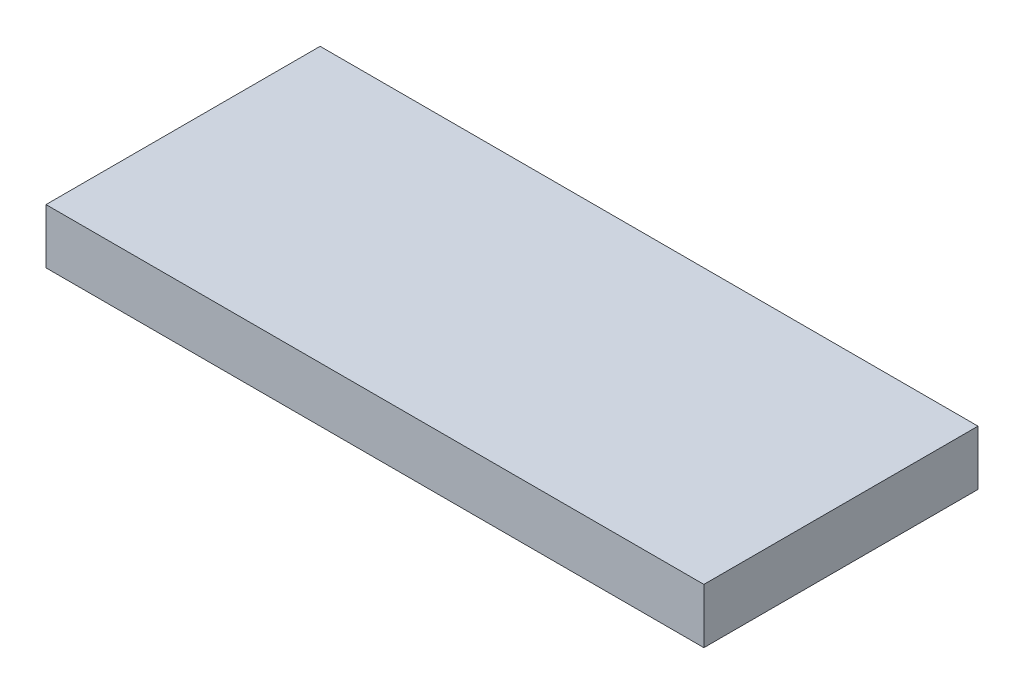
ISO-10303-21;
HEADER;
FILE_DESCRIPTION(('STEP AP214'),'2;1');
FILE_NAME('part.step','',(''),(''),'','','');
FILE_SCHEMA(('AUTOMOTIVE_DESIGN { 1 0 10303 214 1 1 1 1 }'));
ENDSEC;
DATA;
#1=APPLICATION_CONTEXT('core data for automotive mechanical design processes');
#2=APPLICATION_PROTOCOL_DEFINITION('international standard','automotive_design',2000,#1);
#3=PRODUCT_CONTEXT('',#1,'mechanical');
#4=PRODUCT('Part','Part','',(#3));
#5=PRODUCT_RELATED_PRODUCT_CATEGORY('part','',(#4));
#6=PRODUCT_DEFINITION_FORMATION('','',#4);
#7=PRODUCT_DEFINITION_CONTEXT('part definition',#1,'design');
#8=PRODUCT_DEFINITION('design','',#6,#7);
#9=PRODUCT_DEFINITION_SHAPE('','',#8);
#10=(LENGTH_UNIT() NAMED_UNIT(*) SI_UNIT(.MILLI.,.METRE.));
#11=(NAMED_UNIT(*) PLANE_ANGLE_UNIT() SI_UNIT($,.RADIAN.));
#12=(NAMED_UNIT(*) SI_UNIT($,.STERADIAN.) SOLID_ANGLE_UNIT());
#13=UNCERTAINTY_MEASURE_WITH_UNIT(LENGTH_MEASURE(1.E-05),#10,'distance_accuracy_value','');
#14=(GEOMETRIC_REPRESENTATION_CONTEXT(3) GLOBAL_UNCERTAINTY_ASSIGNED_CONTEXT((#13)) GLOBAL_UNIT_ASSIGNED_CONTEXT((#10,
#11,#12)) REPRESENTATION_CONTEXT('',''));
#15=CARTESIAN_POINT('',(0.,0.,0.));
#16=DIRECTION('',(0.,0.,1.));
#17=DIRECTION('',(1.,0.,0.));
#18=AXIS2_PLACEMENT_3D('',#15,#16,#17);
#19=CARTESIAN_POINT('',(60.,10.,-25.));
#20=DIRECTION('',(-1.,0.,0.));
#21=DIRECTION('',(0.,0.,1.));
#22=AXIS2_PLACEMENT_3D('',#19,#20,#21);
#23=PLANE('',#22);
#24=DIRECTION('',(0.,0.,-1.));
#25=VECTOR('',#24,1.);
#26=CARTESIAN_POINT('',(60.,0.,-25.));
#27=LINE('',#26,#25);
#28=CARTESIAN_POINT('',(60.,0.,25.));
#29=VERTEX_POINT('',#28);
#30=CARTESIAN_POINT('',(60.,0.,-25.));
#31=VERTEX_POINT('',#30);
#32=EDGE_CURVE('E102',#29,#31,#27,.T.);
#33=ORIENTED_EDGE('',*,*,#32,.T.);
#34=DIRECTION('',(0.,-1.,0.));
#35=VECTOR('',#34,1.);
#36=CARTESIAN_POINT('',(60.,10.,-25.));
#37=LINE('',#36,#35);
#38=CARTESIAN_POINT('',(60.,10.,-25.));
#39=VERTEX_POINT('',#38);
#40=EDGE_CURVE('E11',#39,#31,#37,.T.);
#41=ORIENTED_EDGE('',*,*,#40,.F.);
#42=DIRECTION('',(0.,0.,-1.));
#43=VECTOR('',#42,1.);
#44=CARTESIAN_POINT('',(60.,10.,-25.));
#45=LINE('',#44,#43);
#46=CARTESIAN_POINT('',(60.,10.,25.));
#47=VERTEX_POINT('',#46);
#48=EDGE_CURVE('E90',#47,#39,#45,.T.);
#49=ORIENTED_EDGE('',*,*,#48,.F.);
#50=DIRECTION('',(0.,-1.,0.));
#51=VECTOR('',#50,1.);
#52=CARTESIAN_POINT('',(60.,10.,25.));
#53=LINE('',#52,#51);
#54=EDGE_CURVE('E98',#47,#29,#53,.T.);
#55=ORIENTED_EDGE('',*,*,#54,.T.);
#56=EDGE_LOOP('',(#33,#41,#49,#55));
#57=FACE_BOUND('',#56,.T.);
#58=ADVANCED_FACE('F39',(#57),#23,.F.);
#59=CARTESIAN_POINT('',(-60.,10.,-25.));
#60=DIRECTION('',(0.,0.,1.));
#61=DIRECTION('',(1.,0.,0.));
#62=AXIS2_PLACEMENT_3D('',#59,#60,#61);
#63=PLANE('',#62);
#64=DIRECTION('',(-1.,0.,0.));
#65=VECTOR('',#64,1.);
#66=CARTESIAN_POINT('',(-60.,0.,-25.));
#67=LINE('',#66,#65);
#68=CARTESIAN_POINT('',(-60.,0.,-25.));
#69=VERTEX_POINT('',#68);
#70=EDGE_CURVE('E94',#31,#69,#67,.T.);
#71=ORIENTED_EDGE('',*,*,#70,.T.);
#72=DIRECTION('',(0.,-1.,0.));
#73=VECTOR('',#72,1.);
#74=CARTESIAN_POINT('',(-60.,10.,-25.));
#75=LINE('',#74,#73);
#76=CARTESIAN_POINT('',(-60.,10.,-25.));
#77=VERTEX_POINT('',#76);
#78=EDGE_CURVE('E47',#77,#69,#75,.T.);
#79=ORIENTED_EDGE('',*,*,#78,.F.);
#80=DIRECTION('',(-1.,0.,0.));
#81=VECTOR('',#80,1.);
#82=CARTESIAN_POINT('',(-60.,10.,-25.));
#83=LINE('',#82,#81);
#84=EDGE_CURVE('E85',#39,#77,#83,.T.);
#85=ORIENTED_EDGE('',*,*,#84,.F.);
#86=ORIENTED_EDGE('',*,*,#40,.T.);
#87=EDGE_LOOP('',(#71,#79,#85,#86));
#88=FACE_BOUND('',#87,.T.);
#89=ADVANCED_FACE('F93',(#88),#63,.F.);
#90=CARTESIAN_POINT('',(-60.,10.,-25.));
#91=DIRECTION('',(1.,0.,0.));
#92=DIRECTION('',(0.,0.,-1.));
#93=AXIS2_PLACEMENT_3D('',#90,#91,#92);
#94=PLANE('',#93);
#95=DIRECTION('',(0.,0.,1.));
#96=VECTOR('',#95,1.);
#97=CARTESIAN_POINT('',(-60.,0.,-25.));
#98=LINE('',#97,#96);
#99=CARTESIAN_POINT('',(-60.,0.,25.));
#100=VERTEX_POINT('',#99);
#101=EDGE_CURVE('E72',#69,#100,#98,.T.);
#102=ORIENTED_EDGE('',*,*,#101,.T.);
#103=DIRECTION('',(0.,-1.,0.));
#104=VECTOR('',#103,1.);
#105=CARTESIAN_POINT('',(-60.,10.,25.));
#106=LINE('',#105,#104);
#107=CARTESIAN_POINT('',(-60.,10.,25.));
#108=VERTEX_POINT('',#107);
#109=EDGE_CURVE('E95',#108,#100,#106,.T.);
#110=ORIENTED_EDGE('',*,*,#109,.F.);
#111=DIRECTION('',(0.,0.,1.));
#112=VECTOR('',#111,1.);
#113=CARTESIAN_POINT('',(-60.,10.,-25.));
#114=LINE('',#113,#112);
#115=EDGE_CURVE('E88',#77,#108,#114,.T.);
#116=ORIENTED_EDGE('',*,*,#115,.F.);
#117=ORIENTED_EDGE('',*,*,#78,.T.);
#118=EDGE_LOOP('',(#102,#110,#116,#117));
#119=FACE_BOUND('',#118,.T.);
#120=ADVANCED_FACE('F96',(#119),#94,.F.);
#121=CARTESIAN_POINT('',(-60.,10.,25.));
#122=DIRECTION('',(0.,0.,-1.));
#123=DIRECTION('',(-1.,0.,0.));
#124=AXIS2_PLACEMENT_3D('',#121,#122,#123);
#125=PLANE('',#124);
#126=DIRECTION('',(1.,0.,0.));
#127=VECTOR('',#126,1.);
#128=CARTESIAN_POINT('',(-60.,0.,25.));
#129=LINE('',#128,#127);
#130=EDGE_CURVE('E78',#100,#29,#129,.T.);
#131=ORIENTED_EDGE('',*,*,#130,.T.);
#132=ORIENTED_EDGE('',*,*,#54,.F.);
#133=DIRECTION('',(1.,0.,0.));
#134=VECTOR('',#133,1.);
#135=CARTESIAN_POINT('',(-60.,10.,25.));
#136=LINE('',#135,#134);
#137=EDGE_CURVE('E55',#108,#47,#136,.T.);
#138=ORIENTED_EDGE('',*,*,#137,.F.);
#139=ORIENTED_EDGE('',*,*,#109,.T.);
#140=EDGE_LOOP('',(#131,#132,#138,#139));
#141=FACE_BOUND('',#140,.T.);
#142=ADVANCED_FACE('F109',(#141),#125,.F.);
#143=CARTESIAN_POINT('',(0.,10.,0.));
#144=DIRECTION('',(0.,1.,0.));
#145=DIRECTION('',(0.,0.,1.));
#146=AXIS2_PLACEMENT_3D('',#143,#144,#145);
#147=PLANE('',#146);
#148=ORIENTED_EDGE('',*,*,#48,.T.);
#149=ORIENTED_EDGE('',*,*,#84,.T.);
#150=ORIENTED_EDGE('',*,*,#115,.T.);
#151=ORIENTED_EDGE('',*,*,#137,.T.);
#152=EDGE_LOOP('',(#148,#149,#150,#151));
#153=FACE_BOUND('',#152,.T.);
#154=ADVANCED_FACE('F86',(#153),#147,.T.);
#155=CARTESIAN_POINT('',(0.,0.,0.));
#156=DIRECTION('',(0.,1.,0.));
#157=DIRECTION('',(0.,0.,1.));
#158=AXIS2_PLACEMENT_3D('',#155,#156,#157);
#159=PLANE('',#158);
#160=ORIENTED_EDGE('',*,*,#32,.F.);
#161=ORIENTED_EDGE('',*,*,#130,.F.);
#162=ORIENTED_EDGE('',*,*,#101,.F.);
#163=ORIENTED_EDGE('',*,*,#70,.F.);
#164=EDGE_LOOP('',(#160,#161,#162,#163));
#165=FACE_BOUND('',#164,.T.);
#166=ADVANCED_FACE('F112',(#165),#159,.F.);
#167=CLOSED_SHELL('',(#58,#89,#120,#142,#154,#166));
#168=MANIFOLD_SOLID_BREP('B2',#167);
#169=ADVANCED_BREP_SHAPE_REPRESENTATION('',(#18,#168),#14);
#170=SHAPE_DEFINITION_REPRESENTATION(#9,#169);
ENDSEC;
END-ISO-10303-21;
